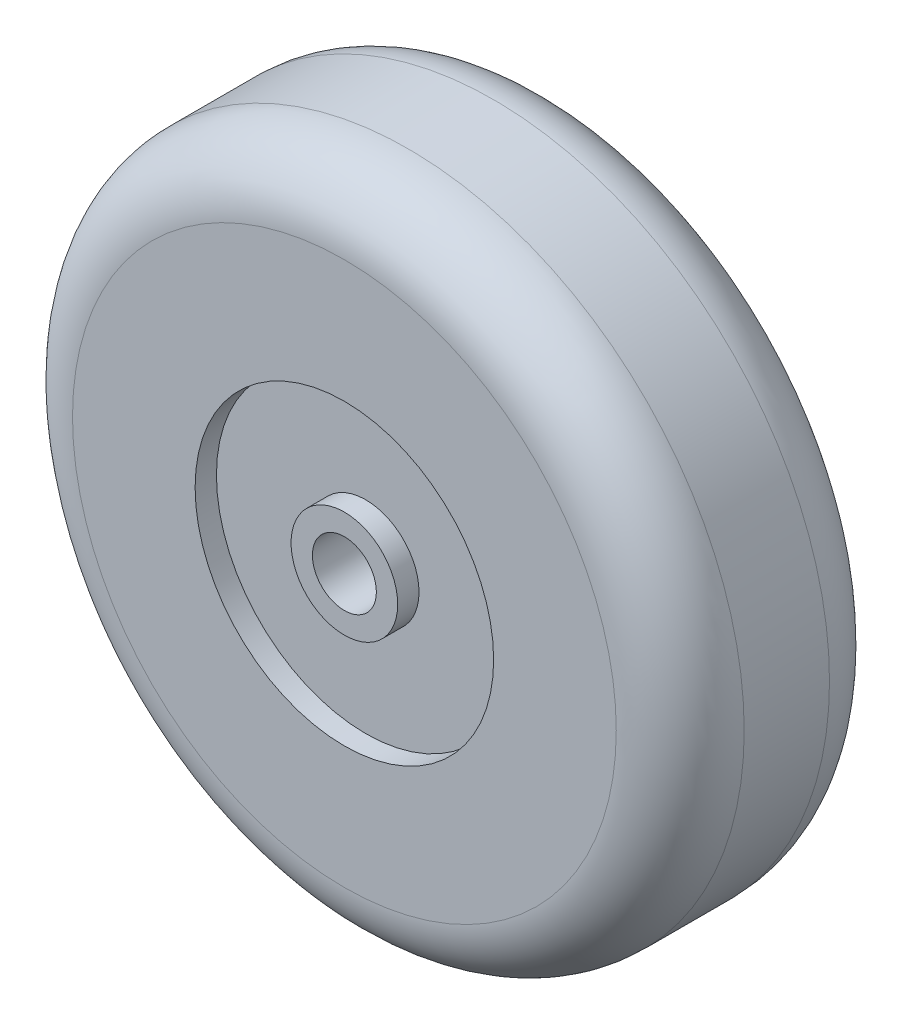
ISO-10303-21;
HEADER;
FILE_DESCRIPTION(('STEP AP214'),'2;1');
FILE_NAME('part.step','',(''),(''),'','','');
FILE_SCHEMA(('AUTOMOTIVE_DESIGN { 1 0 10303 214 1 1 1 1 }'));
ENDSEC;
DATA;
#1=APPLICATION_CONTEXT('core data for automotive mechanical design processes');
#2=APPLICATION_PROTOCOL_DEFINITION('international standard','automotive_design',2000,#1);
#3=PRODUCT_CONTEXT('',#1,'mechanical');
#4=PRODUCT('Part','Part','',(#3));
#5=PRODUCT_RELATED_PRODUCT_CATEGORY('part','',(#4));
#6=PRODUCT_DEFINITION_FORMATION('','',#4);
#7=PRODUCT_DEFINITION_CONTEXT('part definition',#1,'design');
#8=PRODUCT_DEFINITION('design','',#6,#7);
#9=PRODUCT_DEFINITION_SHAPE('','',#8);
#10=(LENGTH_UNIT() NAMED_UNIT(*) SI_UNIT(.MILLI.,.METRE.));
#11=(NAMED_UNIT(*) PLANE_ANGLE_UNIT() SI_UNIT($,.RADIAN.));
#12=(NAMED_UNIT(*) SI_UNIT($,.STERADIAN.) SOLID_ANGLE_UNIT());
#13=UNCERTAINTY_MEASURE_WITH_UNIT(LENGTH_MEASURE(1.E-05),#10,'distance_accuracy_value','');
#14=(GEOMETRIC_REPRESENTATION_CONTEXT(3) GLOBAL_UNCERTAINTY_ASSIGNED_CONTEXT((#13)) GLOBAL_UNIT_ASSIGNED_CONTEXT((#10,
#11,#12)) REPRESENTATION_CONTEXT('',''));
#15=CARTESIAN_POINT('',(0.,0.,0.));
#16=DIRECTION('',(0.,0.,1.));
#17=DIRECTION('',(1.,0.,0.));
#18=AXIS2_PLACEMENT_3D('',#15,#16,#17);
#19=CARTESIAN_POINT('',(-62.5000000000002,-49.9138723622132,0.));
#20=DIRECTION('',(0.,0.,1.));
#21=DIRECTION('',(1.,0.,0.));
#22=AXIS2_PLACEMENT_3D('',#19,#20,#21);
#23=PLANE('',#22);
#24=CARTESIAN_POINT('',(-62.5000000000002,-49.9138723622132,0.));
#25=DIRECTION('',(0.,0.,1.));
#26=DIRECTION('',(1.,0.,0.));
#27=AXIS2_PLACEMENT_3D('',#24,#25,#26);
#28=CIRCLE('',#27,1.5);
#29=CARTESIAN_POINT('',(-61.0000000000002,-49.9138723622132,0.));
#30=VERTEX_POINT('',#29);
#31=EDGE_CURVE('E56',#30,#30,#28,.T.);
#32=ORIENTED_EDGE('',*,*,#31,.T.);
#33=EDGE_LOOP('',(#32));
#34=FACE_BOUND('',#33,.T.);
#35=CARTESIAN_POINT('',(-62.5000000000002,-49.9138723622132,0.));
#36=DIRECTION('',(0.,0.,-1.));
#37=DIRECTION('',(-1.,0.,0.));
#38=AXIS2_PLACEMENT_3D('',#35,#36,#37);
#39=CIRCLE('',#38,2.50000000000001);
#40=CARTESIAN_POINT('',(-65.0000000000002,-49.9138723622132,0.));
#41=VERTEX_POINT('',#40);
#42=EDGE_CURVE('E80',#41,#41,#39,.T.);
#43=ORIENTED_EDGE('',*,*,#42,.T.);
#44=EDGE_LOOP('',(#43));
#45=FACE_BOUND('',#44,.T.);
#46=ADVANCED_FACE('F35',(#34,#45),#23,.F.);
#47=CARTESIAN_POINT('',(-62.5000000000002,-49.9138723622132,10.));
#48=DIRECTION('',(0.,0.,1.));
#49=DIRECTION('',(1.,0.,0.));
#50=AXIS2_PLACEMENT_3D('',#47,#48,#49);
#51=PLANE('',#50);
#52=CARTESIAN_POINT('',(-62.5000000000002,-49.9138723622132,10.));
#53=DIRECTION('',(0.,0.,1.));
#54=DIRECTION('',(1.,0.,0.));
#55=AXIS2_PLACEMENT_3D('',#52,#53,#54);
#56=CIRCLE('',#55,1.5);
#57=CARTESIAN_POINT('',(-61.0000000000002,-49.9138723622132,10.));
#58=VERTEX_POINT('',#57);
#59=EDGE_CURVE('E55',#58,#58,#56,.T.);
#60=ORIENTED_EDGE('',*,*,#59,.F.);
#61=EDGE_LOOP('',(#60));
#62=FACE_BOUND('',#61,.T.);
#63=CARTESIAN_POINT('',(-62.5000000000002,-49.9138723622132,10.));
#64=DIRECTION('',(0.,0.,1.));
#65=DIRECTION('',(1.,0.,0.));
#66=AXIS2_PLACEMENT_3D('',#63,#64,#65);
#67=CIRCLE('',#66,2.5);
#68=CARTESIAN_POINT('',(-60.0000000000002,-49.9138723622132,10.));
#69=VERTEX_POINT('',#68);
#70=EDGE_CURVE('E68',#69,#69,#67,.T.);
#71=ORIENTED_EDGE('',*,*,#70,.T.);
#72=EDGE_LOOP('',(#71));
#73=FACE_BOUND('',#72,.T.);
#74=ADVANCED_FACE('F113',(#62,#73),#51,.T.);
#75=CARTESIAN_POINT('',(-62.5000000000002,-49.9138723622132,10.));
#76=DIRECTION('',(0.,0.,1.));
#77=DIRECTION('',(1.,0.,0.));
#78=AXIS2_PLACEMENT_3D('',#75,#76,#77);
#79=CIRCLE('',#78,12.75);
#80=CARTESIAN_POINT('',(-49.7500000000002,-49.9138723622132,10.));
#81=VERTEX_POINT('',#80);
#82=EDGE_CURVE('E50',#81,#81,#79,.T.);
#83=ORIENTED_EDGE('',*,*,#82,.T.);
#84=EDGE_LOOP('',(#83));
#85=FACE_BOUND('',#84,.T.);
#86=CARTESIAN_POINT('',(-62.5000000000002,-49.9138723622132,10.));
#87=DIRECTION('',(0.,0.,1.));
#88=DIRECTION('',(1.,0.,0.));
#89=AXIS2_PLACEMENT_3D('',#86,#87,#88);
#90=CIRCLE('',#89,7.);
#91=CARTESIAN_POINT('',(-55.5000000000002,-49.9138723622132,10.));
#92=VERTEX_POINT('',#91);
#93=EDGE_CURVE('E62',#92,#92,#90,.T.);
#94=ORIENTED_EDGE('',*,*,#93,.F.);
#95=EDGE_LOOP('',(#94));
#96=FACE_BOUND('',#95,.T.);
#97=ADVANCED_FACE('F105',(#85,#96),#51,.T.);
#98=CARTESIAN_POINT('',(-62.5000000000002,-49.9138723622132,0.));
#99=DIRECTION('',(0.,0.,1.));
#100=DIRECTION('',(1.,0.,0.));
#101=AXIS2_PLACEMENT_3D('',#98,#99,#100);
#102=CIRCLE('',#101,12.75);
#103=CARTESIAN_POINT('',(-49.7500000000002,-49.9138723622132,0.));
#104=VERTEX_POINT('',#103);
#105=EDGE_CURVE('E10',#104,#104,#102,.F.);
#106=ORIENTED_EDGE('',*,*,#105,.T.);
#107=EDGE_LOOP('',(#106));
#108=FACE_BOUND('',#107,.T.);
#109=CARTESIAN_POINT('',(-62.5000000000002,-49.9138723622132,0.));
#110=DIRECTION('',(0.,0.,-1.));
#111=DIRECTION('',(-1.,0.,0.));
#112=AXIS2_PLACEMENT_3D('',#109,#110,#111);
#113=CIRCLE('',#112,7.);
#114=CARTESIAN_POINT('',(-69.5000000000002,-49.9138723622132,0.));
#115=VERTEX_POINT('',#114);
#116=EDGE_CURVE('E74',#115,#115,#113,.T.);
#117=ORIENTED_EDGE('',*,*,#116,.F.);
#118=EDGE_LOOP('',(#117));
#119=FACE_BOUND('',#118,.T.);
#120=ADVANCED_FACE('F102',(#108,#119),#23,.F.);
#121=CARTESIAN_POINT('',(-62.5000000000002,-49.9138723622132,10.));
#122=DIRECTION('',(0.,0.,-1.));
#123=DIRECTION('',(-1.,0.,0.));
#124=AXIS2_PLACEMENT_3D('',#121,#122,#123);
#125=CYLINDRICAL_SURFACE('',#124,15.75);
#126=CARTESIAN_POINT('',(-62.5000000000002,-49.9138723622132,7.));
#127=DIRECTION('',(0.,0.,1.));
#128=DIRECTION('',(1.,0.,0.));
#129=AXIS2_PLACEMENT_3D('',#126,#127,#128);
#130=CIRCLE('',#129,15.75);
#131=CARTESIAN_POINT('',(-46.7500000000002,-49.9138723622132,7.));
#132=VERTEX_POINT('',#131);
#133=EDGE_CURVE('E42',#132,#132,#130,.F.);
#134=ORIENTED_EDGE('',*,*,#133,.T.);
#135=EDGE_LOOP('',(#134));
#136=FACE_BOUND('',#135,.T.);
#137=CARTESIAN_POINT('',(-62.5000000000002,-49.9138723622132,3.));
#138=DIRECTION('',(0.,0.,1.));
#139=DIRECTION('',(1.,0.,0.));
#140=AXIS2_PLACEMENT_3D('',#137,#138,#139);
#141=CIRCLE('',#140,15.75);
#142=CARTESIAN_POINT('',(-46.7500000000002,-49.9138723622132,3.));
#143=VERTEX_POINT('',#142);
#144=EDGE_CURVE('E46',#143,#143,#141,.T.);
#145=ORIENTED_EDGE('',*,*,#144,.T.);
#146=EDGE_LOOP('',(#145));
#147=FACE_BOUND('',#146,.T.);
#148=ADVANCED_FACE('F104',(#136,#147),#125,.T.);
#149=CARTESIAN_POINT('',(-62.5000000000002,-49.9138723622132,10.));
#150=DIRECTION('',(0.,0.,-1.));
#151=DIRECTION('',(-1.,0.,0.));
#152=AXIS2_PLACEMENT_3D('',#149,#150,#151);
#153=CYLINDRICAL_SURFACE('',#152,1.5);
#154=ORIENTED_EDGE('',*,*,#59,.T.);
#155=EDGE_LOOP('',(#154));
#156=FACE_BOUND('',#155,.T.);
#157=ORIENTED_EDGE('',*,*,#31,.F.);
#158=EDGE_LOOP('',(#157));
#159=FACE_BOUND('',#158,.T.);
#160=ADVANCED_FACE('F111',(#156,#159),#153,.F.);
#161=CARTESIAN_POINT('',(-62.5000000000002,-49.9138723622132,9.));
#162=DIRECTION('',(0.,0.,1.));
#163=DIRECTION('',(1.,0.,0.));
#164=AXIS2_PLACEMENT_3D('',#161,#162,#163);
#165=CYLINDRICAL_SURFACE('',#164,7.);
#166=CARTESIAN_POINT('',(-62.5000000000002,-49.9138723622132,9.));
#167=DIRECTION('',(0.,0.,1.));
#168=DIRECTION('',(1.,0.,0.));
#169=AXIS2_PLACEMENT_3D('',#166,#167,#168);
#170=CIRCLE('',#169,7.);
#171=CARTESIAN_POINT('',(-55.5000000000002,-49.9138723622132,9.));
#172=VERTEX_POINT('',#171);
#173=EDGE_CURVE('E59',#172,#172,#170,.T.);
#174=ORIENTED_EDGE('',*,*,#173,.F.);
#175=EDGE_LOOP('',(#174));
#176=FACE_BOUND('',#175,.T.);
#177=ORIENTED_EDGE('',*,*,#93,.T.);
#178=EDGE_LOOP('',(#177));
#179=FACE_BOUND('',#178,.T.);
#180=ADVANCED_FACE('F139',(#176,#179),#165,.F.);
#181=CARTESIAN_POINT('',(-62.5000000000002,-49.9138723622132,9.));
#182=DIRECTION('',(0.,0.,1.));
#183=DIRECTION('',(1.,0.,0.));
#184=AXIS2_PLACEMENT_3D('',#181,#182,#183);
#185=PLANE('',#184);
#186=CARTESIAN_POINT('',(-62.5000000000002,-49.9138723622132,9.));
#187=DIRECTION('',(0.,0.,1.));
#188=DIRECTION('',(1.,0.,0.));
#189=AXIS2_PLACEMENT_3D('',#186,#187,#188);
#190=CIRCLE('',#189,2.5);
#191=CARTESIAN_POINT('',(-60.0000000000002,-49.9138723622132,9.));
#192=VERTEX_POINT('',#191);
#193=EDGE_CURVE('E65',#192,#192,#190,.T.);
#194=ORIENTED_EDGE('',*,*,#193,.F.);
#195=EDGE_LOOP('',(#194));
#196=FACE_BOUND('',#195,.T.);
#197=ORIENTED_EDGE('',*,*,#173,.T.);
#198=EDGE_LOOP('',(#197));
#199=FACE_BOUND('',#198,.T.);
#200=ADVANCED_FACE('F135',(#196,#199),#185,.T.);
#201=CARTESIAN_POINT('',(-62.5000000000002,-49.9138723622132,9.));
#202=DIRECTION('',(0.,0.,1.));
#203=DIRECTION('',(1.,0.,0.));
#204=AXIS2_PLACEMENT_3D('',#201,#202,#203);
#205=CYLINDRICAL_SURFACE('',#204,2.5);
#206=ORIENTED_EDGE('',*,*,#193,.T.);
#207=EDGE_LOOP('',(#206));
#208=FACE_BOUND('',#207,.T.);
#209=ORIENTED_EDGE('',*,*,#70,.F.);
#210=EDGE_LOOP('',(#209));
#211=FACE_BOUND('',#210,.T.);
#212=ADVANCED_FACE('F98',(#208,#211),#205,.T.);
#213=CARTESIAN_POINT('',(-62.5000000000002,-49.9138723622132,1.));
#214=DIRECTION('',(0.,0.,-1.));
#215=DIRECTION('',(-1.,0.,0.));
#216=AXIS2_PLACEMENT_3D('',#213,#214,#215);
#217=CYLINDRICAL_SURFACE('',#216,7.);
#218=CARTESIAN_POINT('',(-62.5000000000002,-49.9138723622132,1.));
#219=DIRECTION('',(0.,0.,-1.));
#220=DIRECTION('',(-1.,0.,0.));
#221=AXIS2_PLACEMENT_3D('',#218,#219,#220);
#222=CIRCLE('',#221,7.);
#223=CARTESIAN_POINT('',(-69.5000000000002,-49.9138723622132,1.));
#224=VERTEX_POINT('',#223);
#225=EDGE_CURVE('E71',#224,#224,#222,.T.);
#226=ORIENTED_EDGE('',*,*,#225,.F.);
#227=EDGE_LOOP('',(#226));
#228=FACE_BOUND('',#227,.T.);
#229=ORIENTED_EDGE('',*,*,#116,.T.);
#230=EDGE_LOOP('',(#229));
#231=FACE_BOUND('',#230,.T.);
#232=ADVANCED_FACE('F92',(#228,#231),#217,.F.);
#233=CARTESIAN_POINT('',(-62.5000000000002,-49.9138723622132,1.));
#234=DIRECTION('',(0.,0.,-1.));
#235=DIRECTION('',(-1.,0.,0.));
#236=AXIS2_PLACEMENT_3D('',#233,#234,#235);
#237=PLANE('',#236);
#238=CARTESIAN_POINT('',(-62.5000000000002,-49.9138723622132,1.));
#239=DIRECTION('',(0.,0.,-1.));
#240=DIRECTION('',(-1.,0.,0.));
#241=AXIS2_PLACEMENT_3D('',#238,#239,#240);
#242=CIRCLE('',#241,2.50000000000001);
#243=CARTESIAN_POINT('',(-65.0000000000002,-49.9138723622132,1.));
#244=VERTEX_POINT('',#243);
#245=EDGE_CURVE('E77',#244,#244,#242,.T.);
#246=ORIENTED_EDGE('',*,*,#245,.F.);
#247=EDGE_LOOP('',(#246));
#248=FACE_BOUND('',#247,.T.);
#249=ORIENTED_EDGE('',*,*,#225,.T.);
#250=EDGE_LOOP('',(#249));
#251=FACE_BOUND('',#250,.T.);
#252=ADVANCED_FACE('F89',(#248,#251),#237,.T.);
#253=CARTESIAN_POINT('',(-62.5000000000002,-49.9138723622132,1.));
#254=DIRECTION('',(0.,0.,-1.));
#255=DIRECTION('',(-1.,0.,0.));
#256=AXIS2_PLACEMENT_3D('',#253,#254,#255);
#257=CYLINDRICAL_SURFACE('',#256,2.50000000000001);
#258=ORIENTED_EDGE('',*,*,#245,.T.);
#259=EDGE_LOOP('',(#258));
#260=FACE_BOUND('',#259,.T.);
#261=ORIENTED_EDGE('',*,*,#42,.F.);
#262=EDGE_LOOP('',(#261));
#263=FACE_BOUND('',#262,.T.);
#264=ADVANCED_FACE('F86',(#260,#263),#257,.T.);
#265=CARTESIAN_POINT('',(-62.5000000000002,-49.9138723622132,7.));
#266=DIRECTION('',(0.,0.,1.));
#267=DIRECTION('',(1.,0.,0.));
#268=AXIS2_PLACEMENT_3D('',#265,#266,#267);
#269=TOROIDAL_SURFACE('',#268,12.75,3.);
#270=ORIENTED_EDGE('',*,*,#133,.F.);
#271=EDGE_LOOP('',(#270));
#272=FACE_BOUND('',#271,.T.);
#273=ORIENTED_EDGE('',*,*,#82,.F.);
#274=EDGE_LOOP('',(#273));
#275=FACE_BOUND('',#274,.T.);
#276=ADVANCED_FACE('F126',(#272,#275),#269,.T.);
#277=CARTESIAN_POINT('',(-62.5000000000002,-49.9138723622132,3.));
#278=DIRECTION('',(0.,0.,1.));
#279=DIRECTION('',(1.,0.,0.));
#280=AXIS2_PLACEMENT_3D('',#277,#278,#279);
#281=TOROIDAL_SURFACE('',#280,12.75,3.);
#282=ORIENTED_EDGE('',*,*,#105,.F.);
#283=EDGE_LOOP('',(#282));
#284=FACE_BOUND('',#283,.T.);
#285=ORIENTED_EDGE('',*,*,#144,.F.);
#286=EDGE_LOOP('',(#285));
#287=FACE_BOUND('',#286,.T.);
#288=ADVANCED_FACE('F37',(#284,#287),#281,.T.);
#289=CLOSED_SHELL('',(#46,#74,#97,#120,#148,#160,#180,#200,#212,#232,#252,#264,#276,#288));
#290=MANIFOLD_SOLID_BREP('B2',#289);
#291=ADVANCED_BREP_SHAPE_REPRESENTATION('',(#18,#290),#14);
#292=SHAPE_DEFINITION_REPRESENTATION(#9,#291);
ENDSEC;
END-ISO-10303-21;
